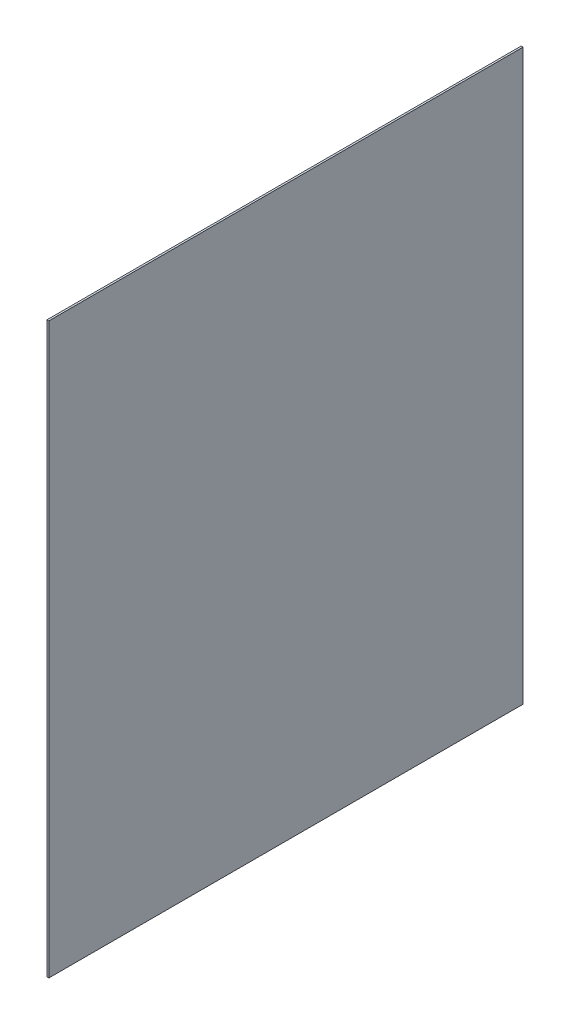
ISO-10303-21;
HEADER;
FILE_DESCRIPTION(('STEP AP214'),'2;1');
FILE_NAME('part.step','',(''),(''),'','','');
FILE_SCHEMA(('AUTOMOTIVE_DESIGN { 1 0 10303 214 1 1 1 1 }'));
ENDSEC;
DATA;
#1=APPLICATION_CONTEXT('core data for automotive mechanical design processes');
#2=APPLICATION_PROTOCOL_DEFINITION('international standard','automotive_design',2000,#1);
#3=PRODUCT_CONTEXT('',#1,'mechanical');
#4=PRODUCT('Part','Part','',(#3));
#5=PRODUCT_RELATED_PRODUCT_CATEGORY('part','',(#4));
#6=PRODUCT_DEFINITION_FORMATION('','',#4);
#7=PRODUCT_DEFINITION_CONTEXT('part definition',#1,'design');
#8=PRODUCT_DEFINITION('design','',#6,#7);
#9=PRODUCT_DEFINITION_SHAPE('','',#8);
#10=(LENGTH_UNIT() NAMED_UNIT(*) SI_UNIT(.MILLI.,.METRE.));
#11=(NAMED_UNIT(*) PLANE_ANGLE_UNIT() SI_UNIT($,.RADIAN.));
#12=(NAMED_UNIT(*) SI_UNIT($,.STERADIAN.) SOLID_ANGLE_UNIT());
#13=UNCERTAINTY_MEASURE_WITH_UNIT(LENGTH_MEASURE(1.E-05),#10,'distance_accuracy_value','');
#14=(GEOMETRIC_REPRESENTATION_CONTEXT(3) GLOBAL_UNCERTAINTY_ASSIGNED_CONTEXT((#13)) GLOBAL_UNIT_ASSIGNED_CONTEXT((#10,
#11,#12)) REPRESENTATION_CONTEXT('',''));
#15=CARTESIAN_POINT('',(0.,0.,0.));
#16=DIRECTION('',(0.,0.,1.));
#17=DIRECTION('',(1.,0.,0.));
#18=AXIS2_PLACEMENT_3D('',#15,#16,#17);
#19=CARTESIAN_POINT('',(5.00000000000026,-1500.,2500.));
#20=DIRECTION('',(0.,-1.,0.));
#21=DIRECTION('',(0.,0.,-1.));
#22=AXIS2_PLACEMENT_3D('',#19,#20,#21);
#23=PLANE('',#22);
#24=DIRECTION('',(-1.,0.,0.));
#25=VECTOR('',#24,1.);
#26=CARTESIAN_POINT('',(5.00000000000026,-1500.,0.));
#27=LINE('',#26,#25);
#28=CARTESIAN_POINT('',(5.00000000000026,-1500.,0.));
#29=VERTEX_POINT('',#28);
#30=CARTESIAN_POINT('',(-4.99999999999974,-1500.,0.));
#31=VERTEX_POINT('',#30);
#32=EDGE_CURVE('E100',#29,#31,#27,.T.);
#33=ORIENTED_EDGE('',*,*,#32,.F.);
#34=DIRECTION('',(0.,0.,-1.));
#35=VECTOR('',#34,1.);
#36=CARTESIAN_POINT('',(5.00000000000026,-1500.,2500.));
#37=LINE('',#36,#35);
#38=CARTESIAN_POINT('',(5.00000000000026,-1500.,2500.));
#39=VERTEX_POINT('',#38);
#40=EDGE_CURVE('E11',#39,#29,#37,.T.);
#41=ORIENTED_EDGE('',*,*,#40,.F.);
#42=DIRECTION('',(-1.,0.,0.));
#43=VECTOR('',#42,1.);
#44=CARTESIAN_POINT('',(5.00000000000026,-1500.,2500.));
#45=LINE('',#44,#43);
#46=CARTESIAN_POINT('',(-4.99999999999974,-1500.,2500.));
#47=VERTEX_POINT('',#46);
#48=EDGE_CURVE('E95',#39,#47,#45,.T.);
#49=ORIENTED_EDGE('',*,*,#48,.T.);
#50=DIRECTION('',(0.,0.,-1.));
#51=VECTOR('',#50,1.);
#52=CARTESIAN_POINT('',(-4.99999999999974,-1500.,2500.));
#53=LINE('',#52,#51);
#54=EDGE_CURVE('E38',#47,#31,#53,.T.);
#55=ORIENTED_EDGE('',*,*,#54,.T.);
#56=EDGE_LOOP('',(#33,#41,#49,#55));
#57=FACE_BOUND('',#56,.T.);
#58=ADVANCED_FACE('F35',(#57),#23,.T.);
#59=CARTESIAN_POINT('',(5.00000000000026,-1500.,2500.));
#60=DIRECTION('',(-1.,0.,0.));
#61=DIRECTION('',(0.,-1.,0.));
#62=AXIS2_PLACEMENT_3D('',#59,#60,#61);
#63=PLANE('',#62);
#64=DIRECTION('',(0.,1.,0.));
#65=VECTOR('',#64,1.);
#66=CARTESIAN_POINT('',(5.00000000000026,-1500.,0.));
#67=LINE('',#66,#65);
#68=CARTESIAN_POINT('',(4.99999999999972,1500.,0.));
#69=VERTEX_POINT('',#68);
#70=EDGE_CURVE('E68',#29,#69,#67,.T.);
#71=ORIENTED_EDGE('',*,*,#70,.T.);
#72=DIRECTION('',(0.,0.,-1.));
#73=VECTOR('',#72,1.);
#74=CARTESIAN_POINT('',(4.99999999999972,1500.,2500.));
#75=LINE('',#74,#73);
#76=CARTESIAN_POINT('',(4.99999999999972,1500.,2500.));
#77=VERTEX_POINT('',#76);
#78=EDGE_CURVE('E44',#77,#69,#75,.T.);
#79=ORIENTED_EDGE('',*,*,#78,.F.);
#80=DIRECTION('',(0.,1.,0.));
#81=VECTOR('',#80,1.);
#82=CARTESIAN_POINT('',(5.00000000000026,-1500.,2500.));
#83=LINE('',#82,#81);
#84=EDGE_CURVE('E85',#39,#77,#83,.T.);
#85=ORIENTED_EDGE('',*,*,#84,.F.);
#86=ORIENTED_EDGE('',*,*,#40,.T.);
#87=EDGE_LOOP('',(#71,#79,#85,#86));
#88=FACE_BOUND('',#87,.T.);
#89=ADVANCED_FACE('F110',(#88),#63,.F.);
#90=CARTESIAN_POINT('',(4.99999999999972,1500.,2500.));
#91=DIRECTION('',(0.,-1.,0.));
#92=DIRECTION('',(0.,0.,-1.));
#93=AXIS2_PLACEMENT_3D('',#90,#91,#92);
#94=PLANE('',#93);
#95=DIRECTION('',(-1.,0.,0.));
#96=VECTOR('',#95,1.);
#97=CARTESIAN_POINT('',(4.99999999999972,1500.,0.));
#98=LINE('',#97,#96);
#99=CARTESIAN_POINT('',(-4.99999999999955,1500.,0.));
#100=VERTEX_POINT('',#99);
#101=EDGE_CURVE('E92',#69,#100,#98,.T.);
#102=ORIENTED_EDGE('',*,*,#101,.T.);
#103=DIRECTION('',(0.,0.,-1.));
#104=VECTOR('',#103,1.);
#105=CARTESIAN_POINT('',(-4.99999999999955,1500.,2500.));
#106=LINE('',#105,#104);
#107=CARTESIAN_POINT('',(-4.99999999999955,1500.,2500.));
#108=VERTEX_POINT('',#107);
#109=EDGE_CURVE('E89',#108,#100,#106,.T.);
#110=ORIENTED_EDGE('',*,*,#109,.F.);
#111=DIRECTION('',(-1.,0.,0.));
#112=VECTOR('',#111,1.);
#113=CARTESIAN_POINT('',(4.99999999999972,1500.,2500.));
#114=LINE('',#113,#112);
#115=EDGE_CURVE('E80',#77,#108,#114,.T.);
#116=ORIENTED_EDGE('',*,*,#115,.F.);
#117=ORIENTED_EDGE('',*,*,#78,.T.);
#118=EDGE_LOOP('',(#102,#110,#116,#117));
#119=FACE_BOUND('',#118,.T.);
#120=ADVANCED_FACE('F90',(#119),#94,.F.);
#121=CARTESIAN_POINT('',(-4.99999999999974,-1500.,2500.));
#122=DIRECTION('',(-1.,0.,0.));
#123=DIRECTION('',(0.,-1.,0.));
#124=AXIS2_PLACEMENT_3D('',#121,#122,#123);
#125=PLANE('',#124);
#126=DIRECTION('',(0.,1.,0.));
#127=VECTOR('',#126,1.);
#128=CARTESIAN_POINT('',(-4.99999999999974,-1500.,0.));
#129=LINE('',#128,#127);
#130=EDGE_CURVE('E103',#31,#100,#129,.T.);
#131=ORIENTED_EDGE('',*,*,#130,.F.);
#132=ORIENTED_EDGE('',*,*,#54,.F.);
#133=DIRECTION('',(0.,1.,0.));
#134=VECTOR('',#133,1.);
#135=CARTESIAN_POINT('',(-4.99999999999974,-1500.,2500.));
#136=LINE('',#135,#134);
#137=EDGE_CURVE('E84',#47,#108,#136,.T.);
#138=ORIENTED_EDGE('',*,*,#137,.T.);
#139=ORIENTED_EDGE('',*,*,#109,.T.);
#140=EDGE_LOOP('',(#131,#132,#138,#139));
#141=FACE_BOUND('',#140,.T.);
#142=ADVANCED_FACE('F94',(#141),#125,.T.);
#143=CARTESIAN_POINT('',(0.,0.,2500.));
#144=DIRECTION('',(0.,0.,-1.));
#145=DIRECTION('',(-1.,0.,0.));
#146=AXIS2_PLACEMENT_3D('',#143,#144,#145);
#147=PLANE('',#146);
#148=ORIENTED_EDGE('',*,*,#48,.F.);
#149=ORIENTED_EDGE('',*,*,#84,.T.);
#150=ORIENTED_EDGE('',*,*,#115,.T.);
#151=ORIENTED_EDGE('',*,*,#137,.F.);
#152=EDGE_LOOP('',(#148,#149,#150,#151));
#153=FACE_BOUND('',#152,.T.);
#154=ADVANCED_FACE('F83',(#153),#147,.F.);
#155=CARTESIAN_POINT('',(0.,0.,0.));
#156=DIRECTION('',(0.,0.,-1.));
#157=DIRECTION('',(-1.,0.,0.));
#158=AXIS2_PLACEMENT_3D('',#155,#156,#157);
#159=PLANE('',#158);
#160=ORIENTED_EDGE('',*,*,#32,.T.);
#161=ORIENTED_EDGE('',*,*,#130,.T.);
#162=ORIENTED_EDGE('',*,*,#101,.F.);
#163=ORIENTED_EDGE('',*,*,#70,.F.);
#164=EDGE_LOOP('',(#160,#161,#162,#163));
#165=FACE_BOUND('',#164,.T.);
#166=ADVANCED_FACE('F108',(#165),#159,.T.);
#167=CLOSED_SHELL('',(#58,#89,#120,#142,#154,#166));
#168=MANIFOLD_SOLID_BREP('B2',#167);
#169=ADVANCED_BREP_SHAPE_REPRESENTATION('',(#18,#168),#14);
#170=SHAPE_DEFINITION_REPRESENTATION(#9,#169);
ENDSEC;
END-ISO-10303-21;
